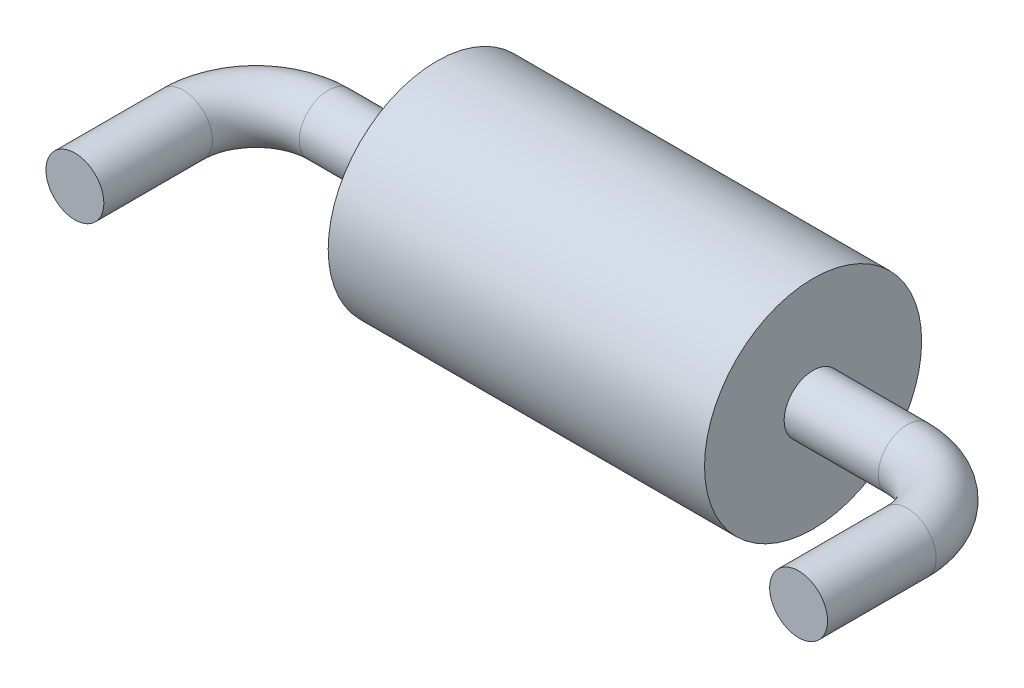
ISO-10303-21;
HEADER;
FILE_DESCRIPTION(('STEP AP214'),'2;1');
FILE_NAME('part.step','',(''),(''),'','','');
FILE_SCHEMA(('AUTOMOTIVE_DESIGN { 1 0 10303 214 1 1 1 1 }'));
ENDSEC;
DATA;
#1=APPLICATION_CONTEXT('core data for automotive mechanical design processes');
#2=APPLICATION_PROTOCOL_DEFINITION('international standard','automotive_design',2000,#1);
#3=PRODUCT_CONTEXT('',#1,'mechanical');
#4=PRODUCT('Part','Part','',(#3));
#5=PRODUCT_RELATED_PRODUCT_CATEGORY('part','',(#4));
#6=PRODUCT_DEFINITION_FORMATION('','',#4);
#7=PRODUCT_DEFINITION_CONTEXT('part definition',#1,'design');
#8=PRODUCT_DEFINITION('design','',#6,#7);
#9=PRODUCT_DEFINITION_SHAPE('','',#8);
#10=(LENGTH_UNIT() NAMED_UNIT(*) SI_UNIT(.MILLI.,.METRE.));
#11=(NAMED_UNIT(*) PLANE_ANGLE_UNIT() SI_UNIT($,.RADIAN.));
#12=(NAMED_UNIT(*) SI_UNIT($,.STERADIAN.) SOLID_ANGLE_UNIT());
#13=UNCERTAINTY_MEASURE_WITH_UNIT(LENGTH_MEASURE(1.E-05),#10,'distance_accuracy_value','');
#14=(GEOMETRIC_REPRESENTATION_CONTEXT(3) GLOBAL_UNCERTAINTY_ASSIGNED_CONTEXT((#13)) GLOBAL_UNIT_ASSIGNED_CONTEXT((#10,
#11,#12)) REPRESENTATION_CONTEXT('',''));
#15=CARTESIAN_POINT('',(0.,0.,0.));
#16=DIRECTION('',(0.,0.,1.));
#17=DIRECTION('',(1.,0.,0.));
#18=AXIS2_PLACEMENT_3D('',#15,#16,#17);
#19=CARTESIAN_POINT('',(5.,0.,2.5));
#20=DIRECTION('',(0.,0.,1.));
#21=DIRECTION('',(1.,0.,0.));
#22=AXIS2_PLACEMENT_3D('',#19,#20,#21);
#23=PLANE('',#22);
#24=CARTESIAN_POINT('',(5.,0.,2.5));
#25=DIRECTION('',(0.,0.,1.));
#26=DIRECTION('',(1.,0.,0.));
#27=AXIS2_PLACEMENT_3D('',#24,#25,#26);
#28=CIRCLE('',#27,0.4);
#29=CARTESIAN_POINT('',(5.4,0.,2.5));
#30=VERTEX_POINT('',#29);
#31=EDGE_CURVE('E18',#30,#30,#28,.F.);
#32=ORIENTED_EDGE('',*,*,#31,.F.);
#33=EDGE_LOOP('',(#32));
#34=FACE_BOUND('',#33,.T.);
#35=ADVANCED_FACE('F15',(#34),#23,.T.);
#36=CARTESIAN_POINT('',(-5.,0.,2.5));
#37=DIRECTION('',(0.,0.,1.));
#38=DIRECTION('',(1.,0.,0.));
#39=AXIS2_PLACEMENT_3D('',#36,#37,#38);
#40=PLANE('',#39);
#41=CARTESIAN_POINT('',(-5.,0.,2.5));
#42=DIRECTION('',(0.,0.,1.));
#43=DIRECTION('',(1.,0.,0.));
#44=AXIS2_PLACEMENT_3D('',#41,#42,#43);
#45=CIRCLE('',#44,0.4);
#46=CARTESIAN_POINT('',(-4.6,0.,2.5));
#47=VERTEX_POINT('',#46);
#48=EDGE_CURVE('E38',#47,#47,#45,.F.);
#49=ORIENTED_EDGE('',*,*,#48,.F.);
#50=EDGE_LOOP('',(#49));
#51=FACE_BOUND('',#50,.T.);
#52=ADVANCED_FACE('F51',(#51),#40,.T.);
#53=CARTESIAN_POINT('',(5.,0.,1.));
#54=DIRECTION('',(0.,0.,1.));
#55=DIRECTION('',(1.,0.,0.));
#56=AXIS2_PLACEMENT_3D('',#53,#54,#55);
#57=CYLINDRICAL_SURFACE('',#56,0.4);
#58=ORIENTED_EDGE('',*,*,#31,.T.);
#59=EDGE_LOOP('',(#58));
#60=FACE_BOUND('',#59,.T.);
#61=CARTESIAN_POINT('',(5.,0.,1.));
#62=DIRECTION('',(0.,0.,1.));
#63=DIRECTION('',(1.,0.,0.));
#64=AXIS2_PLACEMENT_3D('',#61,#62,#63);
#65=CIRCLE('',#64,0.4);
#66=CARTESIAN_POINT('',(5.4,0.,1.));
#67=VERTEX_POINT('',#66);
#68=EDGE_CURVE('E30',#67,#67,#65,.F.);
#69=ORIENTED_EDGE('',*,*,#68,.F.);
#70=EDGE_LOOP('',(#69));
#71=FACE_BOUND('',#70,.T.);
#72=ADVANCED_FACE('F47',(#60,#71),#57,.T.);
#73=CARTESIAN_POINT('',(-5.,0.,1.));
#74=DIRECTION('',(0.,0.,1.));
#75=DIRECTION('',(1.,0.,0.));
#76=AXIS2_PLACEMENT_3D('',#73,#74,#75);
#77=CYLINDRICAL_SURFACE('',#76,0.4);
#78=CARTESIAN_POINT('',(-5.,0.,1.));
#79=DIRECTION('',(0.,0.,1.));
#80=DIRECTION('',(-1.,0.,0.));
#81=AXIS2_PLACEMENT_3D('',#78,#79,#80);
#82=CIRCLE('',#81,0.4);
#83=CARTESIAN_POINT('',(-5.4,0.,1.));
#84=VERTEX_POINT('',#83);
#85=EDGE_CURVE('E43',#84,#84,#82,.F.);
#86=ORIENTED_EDGE('',*,*,#85,.F.);
#87=EDGE_LOOP('',(#86));
#88=FACE_BOUND('',#87,.T.);
#89=ORIENTED_EDGE('',*,*,#48,.T.);
#90=EDGE_LOOP('',(#89));
#91=FACE_BOUND('',#90,.T.);
#92=ADVANCED_FACE('F98',(#88,#91),#77,.T.);
#93=CARTESIAN_POINT('',(4.,0.,1.));
#94=DIRECTION('',(0.,-1.,0.));
#95=DIRECTION('',(0.,0.,-1.));
#96=AXIS2_PLACEMENT_3D('',#93,#94,#95);
#97=TOROIDAL_SURFACE('',#96,1.,0.4);
#98=CARTESIAN_POINT('',(4.,0.,0.));
#99=DIRECTION('',(-1.,0.,0.));
#100=DIRECTION('',(0.,0.,1.));
#101=AXIS2_PLACEMENT_3D('',#98,#99,#100);
#102=CIRCLE('',#101,0.4);
#103=CARTESIAN_POINT('',(4.,0.,0.4));
#104=VERTEX_POINT('',#103);
#105=EDGE_CURVE('E91',#104,#104,#102,.T.);
#106=ORIENTED_EDGE('',*,*,#105,.F.);
#107=EDGE_LOOP('',(#106));
#108=FACE_BOUND('',#107,.T.);
#109=ORIENTED_EDGE('',*,*,#68,.T.);
#110=EDGE_LOOP('',(#109));
#111=FACE_BOUND('',#110,.T.);
#112=ADVANCED_FACE('F84',(#108,#111),#97,.T.);
#113=CARTESIAN_POINT('',(-4.,0.,1.));
#114=DIRECTION('',(0.,1.,0.));
#115=DIRECTION('',(0.,0.,1.));
#116=AXIS2_PLACEMENT_3D('',#113,#114,#115);
#117=TOROIDAL_SURFACE('',#116,1.,0.4);
#118=CARTESIAN_POINT('',(-4.,0.,0.));
#119=DIRECTION('',(1.,0.,0.));
#120=DIRECTION('',(0.,0.,-1.));
#121=AXIS2_PLACEMENT_3D('',#118,#119,#120);
#122=CIRCLE('',#121,0.4);
#123=CARTESIAN_POINT('',(-4.,0.,-0.4));
#124=VERTEX_POINT('',#123);
#125=EDGE_CURVE('E37',#124,#124,#122,.T.);
#126=ORIENTED_EDGE('',*,*,#125,.F.);
#127=EDGE_LOOP('',(#126));
#128=FACE_BOUND('',#127,.T.);
#129=ORIENTED_EDGE('',*,*,#85,.T.);
#130=EDGE_LOOP('',(#129));
#131=FACE_BOUND('',#130,.T.);
#132=ADVANCED_FACE('F79',(#128,#131),#117,.T.);
#133=CARTESIAN_POINT('',(4.,0.,0.));
#134=DIRECTION('',(-1.,0.,0.));
#135=DIRECTION('',(0.,0.,1.));
#136=AXIS2_PLACEMENT_3D('',#133,#134,#135);
#137=CYLINDRICAL_SURFACE('',#136,0.4);
#138=CARTESIAN_POINT('',(2.7,0.,0.));
#139=DIRECTION('',(-1.,0.,0.));
#140=DIRECTION('',(0.,0.,1.));
#141=AXIS2_PLACEMENT_3D('',#138,#139,#140);
#142=CIRCLE('',#141,0.4);
#143=CARTESIAN_POINT('',(2.7,0.,0.4));
#144=VERTEX_POINT('',#143);
#145=EDGE_CURVE('E35',#144,#144,#142,.F.);
#146=ORIENTED_EDGE('',*,*,#145,.T.);
#147=EDGE_LOOP('',(#146));
#148=FACE_BOUND('',#147,.T.);
#149=ORIENTED_EDGE('',*,*,#105,.T.);
#150=EDGE_LOOP('',(#149));
#151=FACE_BOUND('',#150,.T.);
#152=ADVANCED_FACE('F75',(#148,#151),#137,.T.);
#153=CARTESIAN_POINT('',(-4.,0.,0.));
#154=DIRECTION('',(1.,0.,0.));
#155=DIRECTION('',(0.,0.,-1.));
#156=AXIS2_PLACEMENT_3D('',#153,#154,#155);
#157=CYLINDRICAL_SURFACE('',#156,0.4);
#158=ORIENTED_EDGE('',*,*,#125,.T.);
#159=EDGE_LOOP('',(#158));
#160=FACE_BOUND('',#159,.T.);
#161=CARTESIAN_POINT('',(-2.5,0.,0.));
#162=DIRECTION('',(1.,0.,0.));
#163=DIRECTION('',(0.,0.,-1.));
#164=AXIS2_PLACEMENT_3D('',#161,#162,#163);
#165=CIRCLE('',#164,0.4);
#166=CARTESIAN_POINT('',(-2.5,0.,-0.4));
#167=VERTEX_POINT('',#166);
#168=EDGE_CURVE('E27',#167,#167,#165,.F.);
#169=ORIENTED_EDGE('',*,*,#168,.T.);
#170=EDGE_LOOP('',(#169));
#171=FACE_BOUND('',#170,.T.);
#172=ADVANCED_FACE('F71',(#160,#171),#157,.T.);
#173=CARTESIAN_POINT('',(2.7,1.5,0.));
#174=DIRECTION('',(-1.,0.,0.));
#175=DIRECTION('',(0.,0.,1.));
#176=AXIS2_PLACEMENT_3D('',#173,#174,#175);
#177=PLANE('',#176);
#178=CARTESIAN_POINT('',(2.7,0.,0.));
#179=DIRECTION('',(-1.,0.,0.));
#180=DIRECTION('',(0.,0.,1.));
#181=AXIS2_PLACEMENT_3D('',#178,#179,#180);
#182=CIRCLE('',#181,1.5);
#183=CARTESIAN_POINT('',(2.7,0.,1.5));
#184=VERTEX_POINT('',#183);
#185=EDGE_CURVE('E22',#184,#184,#182,.T.);
#186=ORIENTED_EDGE('',*,*,#185,.F.);
#187=EDGE_LOOP('',(#186));
#188=FACE_BOUND('',#187,.T.);
#189=ORIENTED_EDGE('',*,*,#145,.F.);
#190=EDGE_LOOP('',(#189));
#191=FACE_BOUND('',#190,.T.);
#192=ADVANCED_FACE('F64',(#188,#191),#177,.F.);
#193=CARTESIAN_POINT('',(-2.5,1.5,0.));
#194=DIRECTION('',(1.,0.,0.));
#195=DIRECTION('',(0.,0.,-1.));
#196=AXIS2_PLACEMENT_3D('',#193,#194,#195);
#197=PLANE('',#196);
#198=ORIENTED_EDGE('',*,*,#168,.F.);
#199=EDGE_LOOP('',(#198));
#200=FACE_BOUND('',#199,.T.);
#201=CARTESIAN_POINT('',(-2.5,0.,0.));
#202=DIRECTION('',(-1.,0.,0.));
#203=DIRECTION('',(0.,0.,1.));
#204=AXIS2_PLACEMENT_3D('',#201,#202,#203);
#205=CIRCLE('',#204,1.5);
#206=CARTESIAN_POINT('',(-2.5,0.,1.5));
#207=VERTEX_POINT('',#206);
#208=EDGE_CURVE('E10',#207,#207,#205,.F.);
#209=ORIENTED_EDGE('',*,*,#208,.F.);
#210=EDGE_LOOP('',(#209));
#211=FACE_BOUND('',#210,.T.);
#212=ADVANCED_FACE('F59',(#200,#211),#197,.F.);
#213=CARTESIAN_POINT('',(-2.5,0.,0.));
#214=DIRECTION('',(-1.,0.,0.));
#215=DIRECTION('',(0.,0.,1.));
#216=AXIS2_PLACEMENT_3D('',#213,#214,#215);
#217=CYLINDRICAL_SURFACE('',#216,1.5);
#218=ORIENTED_EDGE('',*,*,#208,.T.);
#219=EDGE_LOOP('',(#218));
#220=FACE_BOUND('',#219,.T.);
#221=ORIENTED_EDGE('',*,*,#185,.T.);
#222=EDGE_LOOP('',(#221));
#223=FACE_BOUND('',#222,.T.);
#224=ADVANCED_FACE('F57',(#220,#223),#217,.T.);
#225=CLOSED_SHELL('',(#35,#52,#72,#92,#112,#132,#152,#172,#192,#212,#224));
#226=MANIFOLD_SOLID_BREP('B1',#225);
#227=ADVANCED_BREP_SHAPE_REPRESENTATION('',(#18,#226),#14);
#228=SHAPE_DEFINITION_REPRESENTATION(#9,#227);
ENDSEC;
END-ISO-10303-21;
